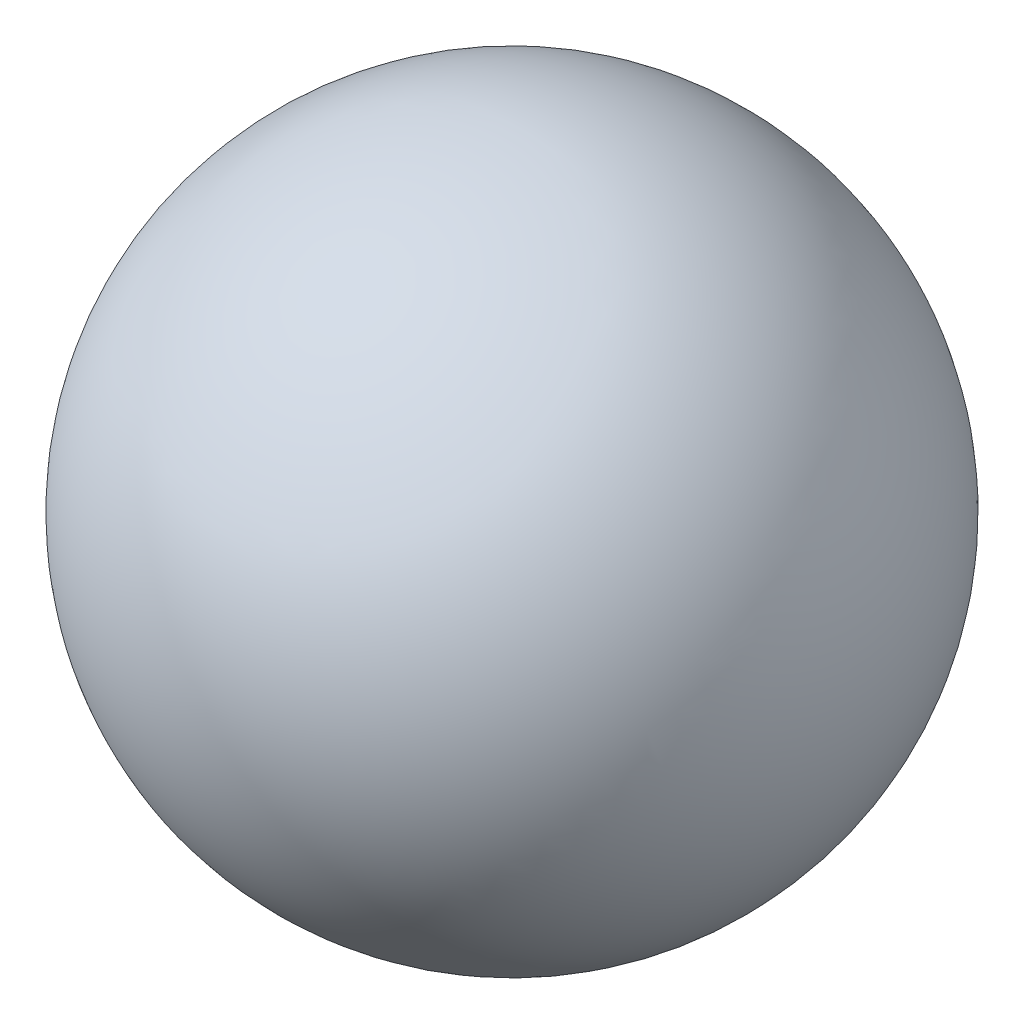
ISO-10303-21;
HEADER;
FILE_DESCRIPTION(('STEP AP214'),'2;1');
FILE_NAME('part.step','',(''),(''),'','','');
FILE_SCHEMA(('AUTOMOTIVE_DESIGN { 1 0 10303 214 1 1 1 1 }'));
ENDSEC;
DATA;
#1=APPLICATION_CONTEXT('core data for automotive mechanical design processes');
#2=APPLICATION_PROTOCOL_DEFINITION('international standard','automotive_design',2000,#1);
#3=PRODUCT_CONTEXT('',#1,'mechanical');
#4=PRODUCT('Part','Part','',(#3));
#5=PRODUCT_RELATED_PRODUCT_CATEGORY('part','',(#4));
#6=PRODUCT_DEFINITION_FORMATION('','',#4);
#7=PRODUCT_DEFINITION_CONTEXT('part definition',#1,'design');
#8=PRODUCT_DEFINITION('design','',#6,#7);
#9=PRODUCT_DEFINITION_SHAPE('','',#8);
#10=(LENGTH_UNIT() NAMED_UNIT(*) SI_UNIT(.MILLI.,.METRE.));
#11=(NAMED_UNIT(*) PLANE_ANGLE_UNIT() SI_UNIT($,.RADIAN.));
#12=(NAMED_UNIT(*) SI_UNIT($,.STERADIAN.) SOLID_ANGLE_UNIT());
#13=UNCERTAINTY_MEASURE_WITH_UNIT(LENGTH_MEASURE(1.E-05),#10,'distance_accuracy_value','');
#14=(GEOMETRIC_REPRESENTATION_CONTEXT(3) GLOBAL_UNCERTAINTY_ASSIGNED_CONTEXT((#13)) GLOBAL_UNIT_ASSIGNED_CONTEXT((#10,
#11,#12)) REPRESENTATION_CONTEXT('',''));
#15=CARTESIAN_POINT('',(0.,0.,0.));
#16=DIRECTION('',(0.,0.,1.));
#17=DIRECTION('',(1.,0.,0.));
#18=AXIS2_PLACEMENT_3D('',#15,#16,#17);
#19=CARTESIAN_POINT('',(0.,0.,0.));
#20=DIRECTION('',(0.,0.,-1.));
#21=DIRECTION('',(1.,0.,0.));
#22=AXIS2_PLACEMENT_3D('',#19,#20,#21);
#23=SPHERICAL_SURFACE('',#22,10.);
#24=CARTESIAN_POINT('',(0.,0.,-9.68245836551854));
#25=DIRECTION('',(0.,0.,1.));
#26=DIRECTION('',(1.,0.,0.));
#27=AXIS2_PLACEMENT_3D('',#24,#25,#26);
#28=CIRCLE('',#27,2.5);
#29=CARTESIAN_POINT('',(2.5,0.,-9.68245836551854));
#30=VERTEX_POINT('',#29);
#31=EDGE_CURVE('E72',#30,#30,#28,.T.);
#32=ORIENTED_EDGE('',*,*,#31,.T.);
#33=EDGE_LOOP('',(#32));
#34=FACE_BOUND('',#33,.T.);
#35=CARTESIAN_POINT('',(-9.68245836551854,0.,0.));
#36=DIRECTION('',(1.,0.,0.));
#37=DIRECTION('',(0.,0.,-1.));
#38=AXIS2_PLACEMENT_3D('',#35,#36,#37);
#39=CIRCLE('',#38,2.5);
#40=CARTESIAN_POINT('',(-9.68245836551854,0.,-2.5));
#41=VERTEX_POINT('',#40);
#42=EDGE_CURVE('E86',#41,#41,#39,.T.);
#43=ORIENTED_EDGE('',*,*,#42,.T.);
#44=EDGE_LOOP('',(#43));
#45=FACE_BOUND('',#44,.T.);
#46=CARTESIAN_POINT('',(0.,-9.68245836551854,0.));
#47=DIRECTION('',(0.,1.,0.));
#48=DIRECTION('',(0.,0.,1.));
#49=AXIS2_PLACEMENT_3D('',#46,#47,#48);
#50=CIRCLE('',#49,2.5);
#51=CARTESIAN_POINT('',(0.,-9.68245836551854,2.5));
#52=VERTEX_POINT('',#51);
#53=EDGE_CURVE('E85',#52,#52,#50,.T.);
#54=ORIENTED_EDGE('',*,*,#53,.T.);
#55=EDGE_LOOP('',(#54));
#56=FACE_BOUND('',#55,.T.);
#57=ADVANCED_FACE('F34',(#34,#45,#56),#23,.T.);
#58=CARTESIAN_POINT('',(0.,-10.,0.));
#59=DIRECTION('',(0.,1.,0.));
#60=DIRECTION('',(0.,0.,1.));
#61=AXIS2_PLACEMENT_3D('',#58,#59,#60);
#62=CYLINDRICAL_SURFACE('',#61,2.5);
#63=CARTESIAN_POINT('',(0.,0.,0.));
#64=DIRECTION('',(0.,1.,0.));
#65=DIRECTION('',(0.,0.,1.));
#66=AXIS2_PLACEMENT_3D('',#63,#64,#65);
#67=CIRCLE('',#66,2.5);
#68=CARTESIAN_POINT('',(0.,0.,2.5));
#69=VERTEX_POINT('',#68);
#70=CARTESIAN_POINT('',(2.5,0.,0.));
#71=VERTEX_POINT('',#70);
#72=EDGE_CURVE('E80',#69,#71,#67,.T.);
#73=ORIENTED_EDGE('',*,*,#72,.T.);
#74=CARTESIAN_POINT('',(0.,0.,0.));
#75=DIRECTION('',(0.,0.707106781186547,-0.707106781186547));
#76=DIRECTION('',(0.,0.707106781186547,0.707106781186547));
#77=AXIS2_PLACEMENT_3D('',#74,#75,#76);
#78=ELLIPSE('',#77,3.53553390593274,2.5);
#79=CARTESIAN_POINT('',(-1.76776695296637,-1.76776695296637,-1.76776695296637));
#80=VERTEX_POINT('',#79);
#81=EDGE_CURVE('E66',#71,#80,#78,.T.);
#82=ORIENTED_EDGE('',*,*,#81,.T.);
#83=CARTESIAN_POINT('',(0.,0.,0.));
#84=DIRECTION('',(-0.707106781186547,0.707106781186547,0.));
#85=DIRECTION('',(0.707106781186547,0.707106781186547,0.));
#86=AXIS2_PLACEMENT_3D('',#83,#84,#85);
#87=ELLIPSE('',#86,3.53553390593274,2.5);
#88=EDGE_CURVE('E55',#80,#69,#87,.T.);
#89=ORIENTED_EDGE('',*,*,#88,.T.);
#90=EDGE_LOOP('',(#73,#82,#89));
#91=FACE_BOUND('',#90,.T.);
#92=ORIENTED_EDGE('',*,*,#53,.F.);
#93=EDGE_LOOP('',(#92));
#94=FACE_BOUND('',#93,.T.);
#95=ADVANCED_FACE('F83',(#91,#94),#62,.F.);
#96=CARTESIAN_POINT('',(0.,0.,0.));
#97=DIRECTION('',(0.,1.,0.));
#98=DIRECTION('',(0.,0.,1.));
#99=AXIS2_PLACEMENT_3D('',#96,#97,#98);
#100=PLANE('',#99);
#101=DIRECTION('',(0.,0.,-1.));
#102=VECTOR('',#101,1.);
#103=CARTESIAN_POINT('',(0.,0.,0.));
#104=LINE('',#103,#102);
#105=CARTESIAN_POINT('',(0.,0.,0.));
#106=VERTEX_POINT('',#105);
#107=EDGE_CURVE('E41',#69,#106,#104,.T.);
#108=ORIENTED_EDGE('',*,*,#107,.T.);
#109=DIRECTION('',(1.,0.,0.));
#110=VECTOR('',#109,1.);
#111=CARTESIAN_POINT('',(0.,0.,0.));
#112=LINE('',#111,#110);
#113=EDGE_CURVE('E48',#106,#71,#112,.T.);
#114=ORIENTED_EDGE('',*,*,#113,.T.);
#115=ORIENTED_EDGE('',*,*,#72,.F.);
#116=EDGE_LOOP('',(#108,#114,#115));
#117=FACE_BOUND('',#116,.T.);
#118=ADVANCED_FACE('F79',(#117),#100,.F.);
#119=CARTESIAN_POINT('',(-10.,0.,0.));
#120=DIRECTION('',(1.,0.,0.));
#121=DIRECTION('',(0.,0.,-1.));
#122=AXIS2_PLACEMENT_3D('',#119,#120,#121);
#123=CYLINDRICAL_SURFACE('',#122,2.5);
#124=ORIENTED_EDGE('',*,*,#88,.F.);
#125=CARTESIAN_POINT('',(0.,0.,0.));
#126=DIRECTION('',(0.707106781186547,0.,-0.707106781186547));
#127=DIRECTION('',(0.707106781186547,0.,0.707106781186547));
#128=AXIS2_PLACEMENT_3D('',#125,#126,#127);
#129=ELLIPSE('',#128,3.53553390593274,2.5);
#130=CARTESIAN_POINT('',(0.,2.5,0.));
#131=VERTEX_POINT('',#130);
#132=EDGE_CURVE('E71',#80,#131,#129,.T.);
#133=ORIENTED_EDGE('',*,*,#132,.T.);
#134=CARTESIAN_POINT('',(0.,0.,0.));
#135=DIRECTION('',(1.,0.,0.));
#136=DIRECTION('',(0.,0.,-1.));
#137=AXIS2_PLACEMENT_3D('',#134,#135,#136);
#138=CIRCLE('',#137,2.5);
#139=EDGE_CURVE('E94',#131,#69,#138,.T.);
#140=ORIENTED_EDGE('',*,*,#139,.T.);
#141=EDGE_LOOP('',(#124,#133,#140));
#142=FACE_BOUND('',#141,.T.);
#143=ORIENTED_EDGE('',*,*,#42,.F.);
#144=EDGE_LOOP('',(#143));
#145=FACE_BOUND('',#144,.T.);
#146=ADVANCED_FACE('F100',(#142,#145),#123,.F.);
#147=CARTESIAN_POINT('',(0.,0.,0.));
#148=DIRECTION('',(1.,0.,0.));
#149=DIRECTION('',(0.,0.,-1.));
#150=AXIS2_PLACEMENT_3D('',#147,#148,#149);
#151=PLANE('',#150);
#152=ORIENTED_EDGE('',*,*,#139,.F.);
#153=DIRECTION('',(0.,-1.,0.));
#154=VECTOR('',#153,1.);
#155=CARTESIAN_POINT('',(0.,0.,0.));
#156=LINE('',#155,#154);
#157=EDGE_CURVE('E11',#131,#106,#156,.T.);
#158=ORIENTED_EDGE('',*,*,#157,.T.);
#159=ORIENTED_EDGE('',*,*,#107,.F.);
#160=EDGE_LOOP('',(#152,#158,#159));
#161=FACE_BOUND('',#160,.T.);
#162=ADVANCED_FACE('F103',(#161),#151,.F.);
#163=CARTESIAN_POINT('',(0.,0.,-10.));
#164=DIRECTION('',(0.,0.,1.));
#165=DIRECTION('',(1.,0.,0.));
#166=AXIS2_PLACEMENT_3D('',#163,#164,#165);
#167=CYLINDRICAL_SURFACE('',#166,2.5);
#168=CARTESIAN_POINT('',(0.,0.,0.));
#169=DIRECTION('',(0.,0.,1.));
#170=DIRECTION('',(1.,0.,0.));
#171=AXIS2_PLACEMENT_3D('',#168,#169,#170);
#172=CIRCLE('',#171,2.5);
#173=EDGE_CURVE('E69',#71,#131,#172,.T.);
#174=ORIENTED_EDGE('',*,*,#173,.T.);
#175=ORIENTED_EDGE('',*,*,#132,.F.);
#176=ORIENTED_EDGE('',*,*,#81,.F.);
#177=EDGE_LOOP('',(#174,#175,#176));
#178=FACE_BOUND('',#177,.T.);
#179=ORIENTED_EDGE('',*,*,#31,.F.);
#180=EDGE_LOOP('',(#179));
#181=FACE_BOUND('',#180,.T.);
#182=ADVANCED_FACE('F67',(#178,#181),#167,.F.);
#183=CARTESIAN_POINT('',(0.,0.,0.));
#184=DIRECTION('',(0.,0.,1.));
#185=DIRECTION('',(1.,0.,0.));
#186=AXIS2_PLACEMENT_3D('',#183,#184,#185);
#187=PLANE('',#186);
#188=ORIENTED_EDGE('',*,*,#157,.F.);
#189=ORIENTED_EDGE('',*,*,#173,.F.);
#190=ORIENTED_EDGE('',*,*,#113,.F.);
#191=EDGE_LOOP('',(#188,#189,#190));
#192=FACE_BOUND('',#191,.T.);
#193=ADVANCED_FACE('F74',(#192),#187,.F.);
#194=CLOSED_SHELL('',(#57,#95,#118,#146,#162,#182,#193));
#195=MANIFOLD_SOLID_BREP('B2',#194);
#196=ADVANCED_BREP_SHAPE_REPRESENTATION('',(#18,#195),#14);
#197=SHAPE_DEFINITION_REPRESENTATION(#9,#196);
ENDSEC;
END-ISO-10303-21;
